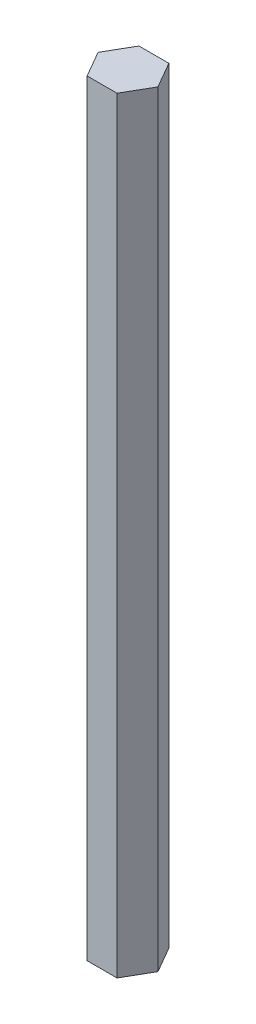
ISO-10303-21;
HEADER;
FILE_DESCRIPTION(('STEP AP214'),'2;1');
FILE_NAME('part.step','',(''),(''),'','','');
FILE_SCHEMA(('AUTOMOTIVE_DESIGN { 1 0 10303 214 1 1 1 1 }'));
ENDSEC;
DATA;
#1=APPLICATION_CONTEXT('core data for automotive mechanical design processes');
#2=APPLICATION_PROTOCOL_DEFINITION('international standard','automotive_design',2000,#1);
#3=PRODUCT_CONTEXT('',#1,'mechanical');
#4=PRODUCT('Part','Part','',(#3));
#5=PRODUCT_RELATED_PRODUCT_CATEGORY('part','',(#4));
#6=PRODUCT_DEFINITION_FORMATION('','',#4);
#7=PRODUCT_DEFINITION_CONTEXT('part definition',#1,'design');
#8=PRODUCT_DEFINITION('design','',#6,#7);
#9=PRODUCT_DEFINITION_SHAPE('','',#8);
#10=(LENGTH_UNIT() NAMED_UNIT(*) SI_UNIT(.MILLI.,.METRE.));
#11=(NAMED_UNIT(*) PLANE_ANGLE_UNIT() SI_UNIT($,.RADIAN.));
#12=(NAMED_UNIT(*) SI_UNIT($,.STERADIAN.) SOLID_ANGLE_UNIT());
#13=UNCERTAINTY_MEASURE_WITH_UNIT(LENGTH_MEASURE(1.E-05),#10,'distance_accuracy_value','');
#14=(GEOMETRIC_REPRESENTATION_CONTEXT(3) GLOBAL_UNCERTAINTY_ASSIGNED_CONTEXT((#13)) GLOBAL_UNIT_ASSIGNED_CONTEXT((#10,
#11,#12)) REPRESENTATION_CONTEXT('',''));
#15=CARTESIAN_POINT('',(0.,0.,0.));
#16=DIRECTION('',(0.,0.,1.));
#17=DIRECTION('',(1.,0.,0.));
#18=AXIS2_PLACEMENT_3D('',#15,#16,#17);
#19=CARTESIAN_POINT('',(3.97705905170191,204.79,5.34885921686965));
#20=DIRECTION('',(-0.866025403784439,0.,-0.5));
#21=DIRECTION('',(-0.5,0.,0.866025403784439));
#22=AXIS2_PLACEMENT_3D('',#19,#20,#21);
#23=PLANE('',#22);
#24=DIRECTION('',(0.5,0.,-0.866025403784439));
#25=VECTOR('',#24,1.);
#26=CARTESIAN_POINT('',(3.97705905170191,0.,5.34885921686965));
#27=LINE('',#26,#25);
#28=CARTESIAN_POINT('',(3.97705905170191,0.,5.34885921686965));
#29=VERTEX_POINT('',#28);
#30=CARTESIAN_POINT('',(7.97705905170191,0.,-1.57934401340586));
#31=VERTEX_POINT('',#30);
#32=EDGE_CURVE('E132',#29,#31,#27,.T.);
#33=ORIENTED_EDGE('',*,*,#32,.T.);
#34=DIRECTION('',(0.,-1.,0.));
#35=VECTOR('',#34,1.);
#36=CARTESIAN_POINT('',(7.97705905170191,204.79,-1.57934401340586));
#37=LINE('',#36,#35);
#38=CARTESIAN_POINT('',(7.97705905170191,204.79,-1.57934401340586));
#39=VERTEX_POINT('',#38);
#40=EDGE_CURVE('E11',#39,#31,#37,.T.);
#41=ORIENTED_EDGE('',*,*,#40,.F.);
#42=DIRECTION('',(0.5,0.,-0.866025403784439));
#43=VECTOR('',#42,1.);
#44=CARTESIAN_POINT('',(3.97705905170191,204.79,5.34885921686965));
#45=LINE('',#44,#43);
#46=CARTESIAN_POINT('',(3.97705905170191,204.79,5.34885921686965));
#47=VERTEX_POINT('',#46);
#48=EDGE_CURVE('E148',#47,#39,#45,.T.);
#49=ORIENTED_EDGE('',*,*,#48,.F.);
#50=DIRECTION('',(0.,-1.,0.));
#51=VECTOR('',#50,1.);
#52=CARTESIAN_POINT('',(3.97705905170191,204.79,5.34885921686965));
#53=LINE('',#52,#51);
#54=EDGE_CURVE('E128',#47,#29,#53,.T.);
#55=ORIENTED_EDGE('',*,*,#54,.T.);
#56=EDGE_LOOP('',(#33,#41,#49,#55));
#57=FACE_BOUND('',#56,.T.);
#58=ADVANCED_FACE('F43',(#57),#23,.F.);
#59=CARTESIAN_POINT('',(7.97705905170191,204.79,-1.57934401340586));
#60=DIRECTION('',(-0.866025403784439,0.,0.5));
#61=DIRECTION('',(0.5,0.,0.866025403784439));
#62=AXIS2_PLACEMENT_3D('',#59,#60,#61);
#63=PLANE('',#62);
#64=DIRECTION('',(-0.5,0.,-0.866025403784439));
#65=VECTOR('',#64,1.);
#66=CARTESIAN_POINT('',(7.97705905170191,0.,-1.57934401340586));
#67=LINE('',#66,#65);
#68=CARTESIAN_POINT('',(3.97705905170191,0.,-8.50754724368137));
#69=VERTEX_POINT('',#68);
#70=EDGE_CURVE('E136',#31,#69,#67,.T.);
#71=ORIENTED_EDGE('',*,*,#70,.T.);
#72=DIRECTION('',(0.,-1.,0.));
#73=VECTOR('',#72,1.);
#74=CARTESIAN_POINT('',(3.97705905170191,204.79,-8.50754724368137));
#75=LINE('',#74,#73);
#76=CARTESIAN_POINT('',(3.97705905170191,204.79,-8.50754724368137));
#77=VERTEX_POINT('',#76);
#78=EDGE_CURVE('E52',#77,#69,#75,.T.);
#79=ORIENTED_EDGE('',*,*,#78,.F.);
#80=DIRECTION('',(-0.5,0.,-0.866025403784439));
#81=VECTOR('',#80,1.);
#82=CARTESIAN_POINT('',(7.97705905170191,204.79,-1.57934401340586));
#83=LINE('',#82,#81);
#84=EDGE_CURVE('E97',#39,#77,#83,.T.);
#85=ORIENTED_EDGE('',*,*,#84,.F.);
#86=ORIENTED_EDGE('',*,*,#40,.T.);
#87=EDGE_LOOP('',(#71,#79,#85,#86));
#88=FACE_BOUND('',#87,.T.);
#89=ADVANCED_FACE('F176',(#88),#63,.F.);
#90=CARTESIAN_POINT('',(3.97705905170191,204.79,-8.50754724368137));
#91=DIRECTION('',(0.,0.,1.));
#92=DIRECTION('',(1.,0.,0.));
#93=AXIS2_PLACEMENT_3D('',#90,#91,#92);
#94=PLANE('',#93);
#95=DIRECTION('',(-1.,0.,0.));
#96=VECTOR('',#95,1.);
#97=CARTESIAN_POINT('',(3.97705905170191,0.,-8.50754724368137));
#98=LINE('',#97,#96);
#99=CARTESIAN_POINT('',(-4.02294094829809,0.,-8.50754724368137));
#100=VERTEX_POINT('',#99);
#101=EDGE_CURVE('E139',#69,#100,#98,.T.);
#102=ORIENTED_EDGE('',*,*,#101,.T.);
#103=DIRECTION('',(0.,-1.,0.));
#104=VECTOR('',#103,1.);
#105=CARTESIAN_POINT('',(-4.02294094829809,204.79,-8.50754724368137));
#106=LINE('',#105,#104);
#107=CARTESIAN_POINT('',(-4.02294094829809,204.79,-8.50754724368137));
#108=VERTEX_POINT('',#107);
#109=EDGE_CURVE('E121',#108,#100,#106,.T.);
#110=ORIENTED_EDGE('',*,*,#109,.F.);
#111=DIRECTION('',(-1.,0.,0.));
#112=VECTOR('',#111,1.);
#113=CARTESIAN_POINT('',(3.97705905170191,204.79,-8.50754724368137));
#114=LINE('',#113,#112);
#115=EDGE_CURVE('E110',#77,#108,#114,.T.);
#116=ORIENTED_EDGE('',*,*,#115,.F.);
#117=ORIENTED_EDGE('',*,*,#78,.T.);
#118=EDGE_LOOP('',(#102,#110,#116,#117));
#119=FACE_BOUND('',#118,.T.);
#120=ADVANCED_FACE('F158',(#119),#94,.F.);
#121=CARTESIAN_POINT('',(-4.02294094829809,204.79,-8.50754724368137));
#122=DIRECTION('',(0.866025403784438,0.,0.5));
#123=DIRECTION('',(0.5,0.,-0.866025403784439));
#124=AXIS2_PLACEMENT_3D('',#121,#122,#123);
#125=PLANE('',#124);
#126=DIRECTION('',(-0.5,0.,0.866025403784439));
#127=VECTOR('',#126,1.);
#128=CARTESIAN_POINT('',(-4.02294094829809,0.,-8.50754724368137));
#129=LINE('',#128,#127);
#130=CARTESIAN_POINT('',(-8.02294094829809,0.,-1.57934401340586));
#131=VERTEX_POINT('',#130);
#132=EDGE_CURVE('E119',#100,#131,#129,.T.);
#133=ORIENTED_EDGE('',*,*,#132,.T.);
#134=DIRECTION('',(0.,-1.,0.));
#135=VECTOR('',#134,1.);
#136=CARTESIAN_POINT('',(-8.02294094829809,204.79,-1.57934401340586));
#137=LINE('',#136,#135);
#138=CARTESIAN_POINT('',(-8.02294094829809,204.79,-1.57934401340586));
#139=VERTEX_POINT('',#138);
#140=EDGE_CURVE('E116',#139,#131,#137,.T.);
#141=ORIENTED_EDGE('',*,*,#140,.F.);
#142=DIRECTION('',(-0.5,0.,0.866025403784439));
#143=VECTOR('',#142,1.);
#144=CARTESIAN_POINT('',(-4.02294094829809,204.79,-8.50754724368137));
#145=LINE('',#144,#143);
#146=EDGE_CURVE('E104',#108,#139,#145,.T.);
#147=ORIENTED_EDGE('',*,*,#146,.F.);
#148=ORIENTED_EDGE('',*,*,#109,.T.);
#149=EDGE_LOOP('',(#133,#141,#147,#148));
#150=FACE_BOUND('',#149,.T.);
#151=ADVANCED_FACE('F117',(#150),#125,.F.);
#152=CARTESIAN_POINT('',(-8.02294094829809,204.79,-1.57934401340586));
#153=DIRECTION('',(0.866025403784438,0.,-0.500000000000001));
#154=DIRECTION('',(-0.500000000000001,0.,-0.866025403784438));
#155=AXIS2_PLACEMENT_3D('',#152,#153,#154);
#156=PLANE('',#155);
#157=DIRECTION('',(0.500000000000001,0.,0.866025403784438));
#158=VECTOR('',#157,1.);
#159=CARTESIAN_POINT('',(-8.02294094829809,0.,-1.57934401340586));
#160=LINE('',#159,#158);
#161=CARTESIAN_POINT('',(-4.02294094829809,0.,5.34885921686965));
#162=VERTEX_POINT('',#161);
#163=EDGE_CURVE('E83',#131,#162,#160,.T.);
#164=ORIENTED_EDGE('',*,*,#163,.T.);
#165=DIRECTION('',(0.,-1.,0.));
#166=VECTOR('',#165,1.);
#167=CARTESIAN_POINT('',(-4.02294094829809,204.79,5.34885921686965));
#168=LINE('',#167,#166);
#169=CARTESIAN_POINT('',(-4.02294094829809,204.79,5.34885921686965));
#170=VERTEX_POINT('',#169);
#171=EDGE_CURVE('E122',#170,#162,#168,.T.);
#172=ORIENTED_EDGE('',*,*,#171,.F.);
#173=DIRECTION('',(0.500000000000001,0.,0.866025403784438));
#174=VECTOR('',#173,1.);
#175=CARTESIAN_POINT('',(-8.02294094829809,204.79,-1.57934401340586));
#176=LINE('',#175,#174);
#177=EDGE_CURVE('E108',#139,#170,#176,.T.);
#178=ORIENTED_EDGE('',*,*,#177,.F.);
#179=ORIENTED_EDGE('',*,*,#140,.T.);
#180=EDGE_LOOP('',(#164,#172,#178,#179));
#181=FACE_BOUND('',#180,.T.);
#182=ADVANCED_FACE('F124',(#181),#156,.F.);
#183=CARTESIAN_POINT('',(-4.02294094829809,204.79,5.34885921686965));
#184=DIRECTION('',(0.,0.,-1.));
#185=DIRECTION('',(-1.,0.,0.));
#186=AXIS2_PLACEMENT_3D('',#183,#184,#185);
#187=PLANE('',#186);
#188=DIRECTION('',(1.,0.,0.));
#189=VECTOR('',#188,1.);
#190=CARTESIAN_POINT('',(-4.02294094829809,0.,5.34885921686965));
#191=LINE('',#190,#189);
#192=EDGE_CURVE('E89',#162,#29,#191,.T.);
#193=ORIENTED_EDGE('',*,*,#192,.T.);
#194=ORIENTED_EDGE('',*,*,#54,.F.);
#195=DIRECTION('',(1.,0.,0.));
#196=VECTOR('',#195,1.);
#197=CARTESIAN_POINT('',(-4.02294094829809,204.79,5.34885921686965));
#198=LINE('',#197,#196);
#199=EDGE_CURVE('E60',#170,#47,#198,.T.);
#200=ORIENTED_EDGE('',*,*,#199,.F.);
#201=ORIENTED_EDGE('',*,*,#171,.T.);
#202=EDGE_LOOP('',(#193,#194,#200,#201));
#203=FACE_BOUND('',#202,.T.);
#204=ADVANCED_FACE('F165',(#203),#187,.F.);
#205=CARTESIAN_POINT('',(0.,204.79,0.));
#206=DIRECTION('',(0.,1.,0.));
#207=DIRECTION('',(0.,0.,1.));
#208=AXIS2_PLACEMENT_3D('',#205,#206,#207);
#209=PLANE('',#208);
#210=ORIENTED_EDGE('',*,*,#48,.T.);
#211=ORIENTED_EDGE('',*,*,#84,.T.);
#212=ORIENTED_EDGE('',*,*,#115,.T.);
#213=ORIENTED_EDGE('',*,*,#146,.T.);
#214=ORIENTED_EDGE('',*,*,#177,.T.);
#215=ORIENTED_EDGE('',*,*,#199,.T.);
#216=EDGE_LOOP('',(#210,#211,#212,#213,#214,#215));
#217=FACE_BOUND('',#216,.T.);
#218=ADVANCED_FACE('F106',(#217),#209,.T.);
#219=CARTESIAN_POINT('',(0.,0.,0.));
#220=DIRECTION('',(0.,1.,0.));
#221=DIRECTION('',(0.,0.,1.));
#222=AXIS2_PLACEMENT_3D('',#219,#220,#221);
#223=PLANE('',#222);
#224=ORIENTED_EDGE('',*,*,#32,.F.);
#225=ORIENTED_EDGE('',*,*,#192,.F.);
#226=ORIENTED_EDGE('',*,*,#163,.F.);
#227=ORIENTED_EDGE('',*,*,#132,.F.);
#228=ORIENTED_EDGE('',*,*,#101,.F.);
#229=ORIENTED_EDGE('',*,*,#70,.F.);
#230=EDGE_LOOP('',(#224,#225,#226,#227,#228,#229));
#231=FACE_BOUND('',#230,.T.);
#232=ADVANCED_FACE('F161',(#231),#223,.F.);
#233=CLOSED_SHELL('',(#58,#89,#120,#151,#182,#204,#218,#232));
#234=MANIFOLD_SOLID_BREP('B2',#233);
#235=ADVANCED_BREP_SHAPE_REPRESENTATION('',(#18,#234),#14);
#236=SHAPE_DEFINITION_REPRESENTATION(#9,#235);
ENDSEC;
END-ISO-10303-21;
